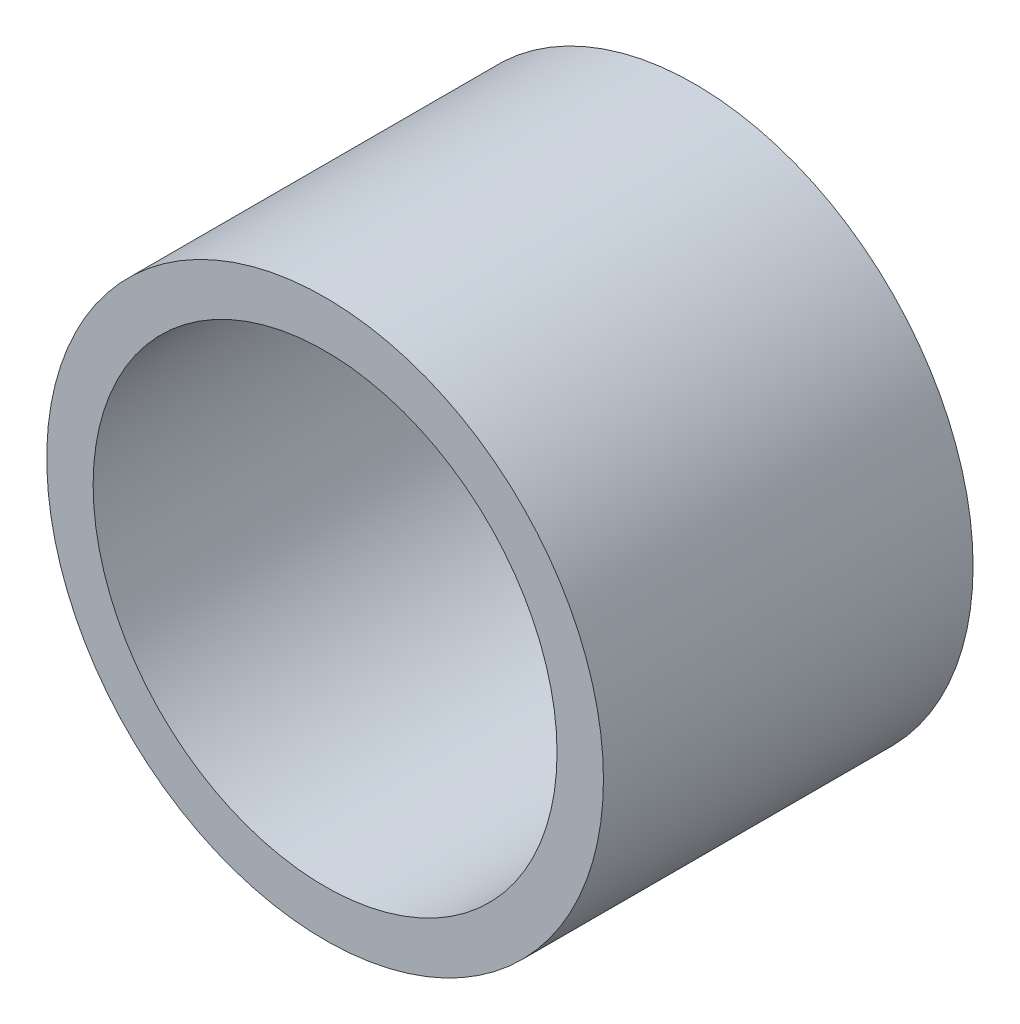
ISO-10303-21;
HEADER;
FILE_DESCRIPTION(('STEP AP214'),'2;1');
FILE_NAME('part.step','',(''),(''),'','','');
FILE_SCHEMA(('AUTOMOTIVE_DESIGN { 1 0 10303 214 1 1 1 1 }'));
ENDSEC;
DATA;
#1=APPLICATION_CONTEXT('core data for automotive mechanical design processes');
#2=APPLICATION_PROTOCOL_DEFINITION('international standard','automotive_design',2000,#1);
#3=PRODUCT_CONTEXT('',#1,'mechanical');
#4=PRODUCT('Part','Part','',(#3));
#5=PRODUCT_RELATED_PRODUCT_CATEGORY('part','',(#4));
#6=PRODUCT_DEFINITION_FORMATION('','',#4);
#7=PRODUCT_DEFINITION_CONTEXT('part definition',#1,'design');
#8=PRODUCT_DEFINITION('design','',#6,#7);
#9=PRODUCT_DEFINITION_SHAPE('','',#8);
#10=(LENGTH_UNIT() NAMED_UNIT(*) SI_UNIT(.MILLI.,.METRE.));
#11=(NAMED_UNIT(*) PLANE_ANGLE_UNIT() SI_UNIT($,.RADIAN.));
#12=(NAMED_UNIT(*) SI_UNIT($,.STERADIAN.) SOLID_ANGLE_UNIT());
#13=UNCERTAINTY_MEASURE_WITH_UNIT(LENGTH_MEASURE(1.E-05),#10,'distance_accuracy_value','');
#14=(GEOMETRIC_REPRESENTATION_CONTEXT(3) GLOBAL_UNCERTAINTY_ASSIGNED_CONTEXT((#13)) GLOBAL_UNIT_ASSIGNED_CONTEXT((#10,
#11,#12)) REPRESENTATION_CONTEXT('',''));
#15=CARTESIAN_POINT('',(0.,0.,0.));
#16=DIRECTION('',(0.,0.,1.));
#17=DIRECTION('',(1.,0.,0.));
#18=AXIS2_PLACEMENT_3D('',#15,#16,#17);
#19=CARTESIAN_POINT('',(0.,0.,12.6492));
#20=DIRECTION('',(0.,0.,1.));
#21=DIRECTION('',(1.,0.,0.));
#22=AXIS2_PLACEMENT_3D('',#19,#20,#21);
#23=PLANE('',#22);
#24=CARTESIAN_POINT('',(0.,0.,12.6492));
#25=DIRECTION('',(0.,0.,1.));
#26=DIRECTION('',(1.,0.,0.));
#27=AXIS2_PLACEMENT_3D('',#24,#25,#26);
#28=CIRCLE('',#27,9.525);
#29=CARTESIAN_POINT('',(9.525,0.,12.6492));
#30=VERTEX_POINT('',#29);
#31=EDGE_CURVE('E10',#30,#30,#28,.T.);
#32=ORIENTED_EDGE('',*,*,#31,.T.);
#33=EDGE_LOOP('',(#32));
#34=FACE_BOUND('',#33,.T.);
#35=CARTESIAN_POINT('',(0.,0.,12.6492));
#36=DIRECTION('',(0.,0.,1.));
#37=DIRECTION('',(1.,0.,0.));
#38=AXIS2_PLACEMENT_3D('',#35,#36,#37);
#39=CIRCLE('',#38,7.9375);
#40=CARTESIAN_POINT('',(7.9375,0.,12.6492));
#41=VERTEX_POINT('',#40);
#42=EDGE_CURVE('E42',#41,#41,#39,.T.);
#43=ORIENTED_EDGE('',*,*,#42,.F.);
#44=EDGE_LOOP('',(#43));
#45=FACE_BOUND('',#44,.T.);
#46=ADVANCED_FACE('F31',(#34,#45),#23,.T.);
#47=CARTESIAN_POINT('',(0.,0.,0.));
#48=DIRECTION('',(0.,0.,1.));
#49=DIRECTION('',(1.,0.,0.));
#50=AXIS2_PLACEMENT_3D('',#47,#48,#49);
#51=PLANE('',#50);
#52=CARTESIAN_POINT('',(0.,0.,0.));
#53=DIRECTION('',(0.,0.,1.));
#54=DIRECTION('',(1.,0.,0.));
#55=AXIS2_PLACEMENT_3D('',#52,#53,#54);
#56=CIRCLE('',#55,9.525);
#57=CARTESIAN_POINT('',(9.525,0.,0.));
#58=VERTEX_POINT('',#57);
#59=EDGE_CURVE('E35',#58,#58,#56,.T.);
#60=ORIENTED_EDGE('',*,*,#59,.F.);
#61=EDGE_LOOP('',(#60));
#62=FACE_BOUND('',#61,.T.);
#63=CARTESIAN_POINT('',(0.,0.,0.));
#64=DIRECTION('',(0.,0.,1.));
#65=DIRECTION('',(1.,0.,0.));
#66=AXIS2_PLACEMENT_3D('',#63,#64,#65);
#67=CIRCLE('',#66,7.9375);
#68=CARTESIAN_POINT('',(7.9375,0.,0.));
#69=VERTEX_POINT('',#68);
#70=EDGE_CURVE('E44',#69,#69,#67,.T.);
#71=ORIENTED_EDGE('',*,*,#70,.T.);
#72=EDGE_LOOP('',(#71));
#73=FACE_BOUND('',#72,.T.);
#74=ADVANCED_FACE('F54',(#62,#73),#51,.F.);
#75=CARTESIAN_POINT('',(0.,0.,12.6492));
#76=DIRECTION('',(0.,0.,-1.));
#77=DIRECTION('',(-1.,0.,0.));
#78=AXIS2_PLACEMENT_3D('',#75,#76,#77);
#79=CYLINDRICAL_SURFACE('',#78,9.525);
#80=ORIENTED_EDGE('',*,*,#31,.F.);
#81=EDGE_LOOP('',(#80));
#82=FACE_BOUND('',#81,.T.);
#83=ORIENTED_EDGE('',*,*,#59,.T.);
#84=EDGE_LOOP('',(#83));
#85=FACE_BOUND('',#84,.T.);
#86=ADVANCED_FACE('F33',(#82,#85),#79,.T.);
#87=CARTESIAN_POINT('',(0.,0.,12.6492));
#88=DIRECTION('',(0.,0.,-1.));
#89=DIRECTION('',(-1.,0.,0.));
#90=AXIS2_PLACEMENT_3D('',#87,#88,#89);
#91=CYLINDRICAL_SURFACE('',#90,7.9375);
#92=ORIENTED_EDGE('',*,*,#42,.T.);
#93=EDGE_LOOP('',(#92));
#94=FACE_BOUND('',#93,.T.);
#95=ORIENTED_EDGE('',*,*,#70,.F.);
#96=EDGE_LOOP('',(#95));
#97=FACE_BOUND('',#96,.T.);
#98=ADVANCED_FACE('F50',(#94,#97),#91,.F.);
#99=CLOSED_SHELL('',(#46,#74,#86,#98));
#100=MANIFOLD_SOLID_BREP('B2',#99);
#101=ADVANCED_BREP_SHAPE_REPRESENTATION('',(#18,#100),#14);
#102=SHAPE_DEFINITION_REPRESENTATION(#9,#101);
ENDSEC;
END-ISO-10303-21;
